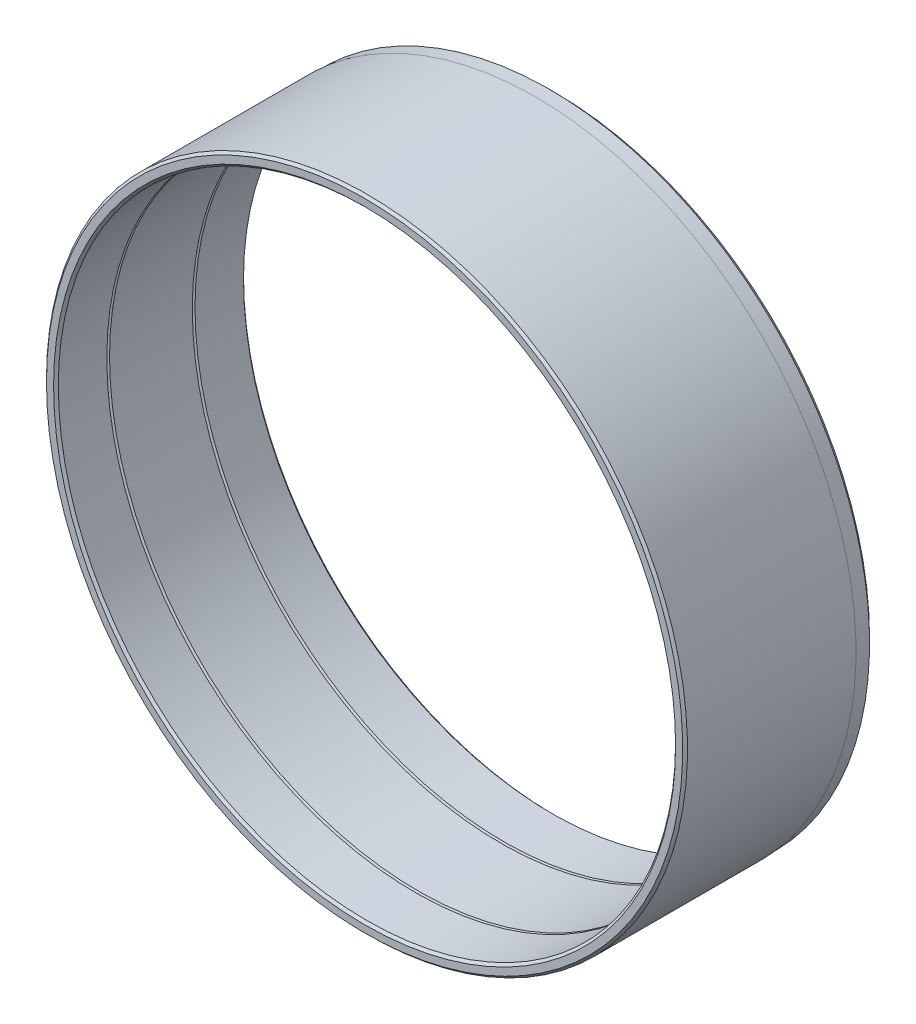
ISO-10303-21;
HEADER;
FILE_DESCRIPTION(('STEP AP214'),'2;1');
FILE_NAME('part.step','',(''),(''),'','','');
FILE_SCHEMA(('AUTOMOTIVE_DESIGN { 1 0 10303 214 1 1 1 1 }'));
ENDSEC;
DATA;
#1=APPLICATION_CONTEXT('core data for automotive mechanical design processes');
#2=APPLICATION_PROTOCOL_DEFINITION('international standard','automotive_design',2000,#1);
#3=PRODUCT_CONTEXT('',#1,'mechanical');
#4=PRODUCT('Part','Part','',(#3));
#5=PRODUCT_RELATED_PRODUCT_CATEGORY('part','',(#4));
#6=PRODUCT_DEFINITION_FORMATION('','',#4);
#7=PRODUCT_DEFINITION_CONTEXT('part definition',#1,'design');
#8=PRODUCT_DEFINITION('design','',#6,#7);
#9=PRODUCT_DEFINITION_SHAPE('','',#8);
#10=(LENGTH_UNIT() NAMED_UNIT(*) SI_UNIT(.MILLI.,.METRE.));
#11=(NAMED_UNIT(*) PLANE_ANGLE_UNIT() SI_UNIT($,.RADIAN.));
#12=(NAMED_UNIT(*) SI_UNIT($,.STERADIAN.) SOLID_ANGLE_UNIT());
#13=UNCERTAINTY_MEASURE_WITH_UNIT(LENGTH_MEASURE(1.E-05),#10,'distance_accuracy_value','');
#14=(GEOMETRIC_REPRESENTATION_CONTEXT(3) GLOBAL_UNCERTAINTY_ASSIGNED_CONTEXT((#13)) GLOBAL_UNIT_ASSIGNED_CONTEXT((#10,
#11,#12)) REPRESENTATION_CONTEXT('',''));
#15=CARTESIAN_POINT('',(0.,0.,0.));
#16=DIRECTION('',(0.,0.,1.));
#17=DIRECTION('',(1.,0.,0.));
#18=AXIS2_PLACEMENT_3D('',#15,#16,#17);
#19=CARTESIAN_POINT('',(0.,0.,0.));
#20=DIRECTION('',(0.,0.,-1.));
#21=DIRECTION('',(-1.,0.,0.));
#22=AXIS2_PLACEMENT_3D('',#19,#20,#21);
#23=PLANE('',#22);
#24=CARTESIAN_POINT('',(0.,0.,0.));
#25=DIRECTION('',(0.,0.,-1.));
#26=DIRECTION('',(-1.,0.,0.));
#27=AXIS2_PLACEMENT_3D('',#24,#25,#26);
#28=CIRCLE('',#27,65.5);
#29=CARTESIAN_POINT('',(-65.5,0.,0.));
#30=VERTEX_POINT('',#29);
#31=EDGE_CURVE('E53',#30,#30,#28,.F.);
#32=ORIENTED_EDGE('',*,*,#31,.T.);
#33=EDGE_LOOP('',(#32));
#34=FACE_BOUND('',#33,.T.);
#35=CARTESIAN_POINT('',(0.,0.,0.));
#36=DIRECTION('',(0.,0.,-1.));
#37=DIRECTION('',(-1.,0.,0.));
#38=AXIS2_PLACEMENT_3D('',#35,#36,#37);
#39=CIRCLE('',#38,66.35);
#40=CARTESIAN_POINT('',(-66.35,0.,0.));
#41=VERTEX_POINT('',#40);
#42=EDGE_CURVE('E65',#41,#41,#39,.T.);
#43=ORIENTED_EDGE('',*,*,#42,.T.);
#44=EDGE_LOOP('',(#43));
#45=FACE_BOUND('',#44,.T.);
#46=ADVANCED_FACE('F39',(#34,#45),#23,.T.);
#47=CARTESIAN_POINT('',(0.,0.,0.));
#48=DIRECTION('',(0.,0.,1.));
#49=DIRECTION('',(1.,0.,0.));
#50=AXIS2_PLACEMENT_3D('',#47,#48,#49);
#51=CONICAL_SURFACE('',#50,66.35,0.785398163397452);
#52=CARTESIAN_POINT('',(0.,0.,1.00000000000001));
#53=DIRECTION('',(0.,0.,-1.));
#54=DIRECTION('',(-1.,0.,0.));
#55=AXIS2_PLACEMENT_3D('',#52,#53,#54);
#56=CIRCLE('',#55,67.35);
#57=CARTESIAN_POINT('',(-67.35,0.,1.00000000000001));
#58=VERTEX_POINT('',#57);
#59=EDGE_CURVE('E69',#58,#58,#56,.T.);
#60=ORIENTED_EDGE('',*,*,#59,.T.);
#61=EDGE_LOOP('',(#60));
#62=FACE_BOUND('',#61,.T.);
#63=ORIENTED_EDGE('',*,*,#42,.F.);
#64=EDGE_LOOP('',(#63));
#65=FACE_BOUND('',#64,.T.);
#66=ADVANCED_FACE('F131',(#62,#65),#51,.T.);
#67=CARTESIAN_POINT('',(0.,0.,0.));
#68=DIRECTION('',(0.,0.,-1.));
#69=DIRECTION('',(-1.,0.,0.));
#70=AXIS2_PLACEMENT_3D('',#67,#68,#69);
#71=CYLINDRICAL_SURFACE('',#70,67.35);
#72=CARTESIAN_POINT('',(0.,0.,3.99999999999999));
#73=DIRECTION('',(0.,0.,-1.));
#74=DIRECTION('',(-1.,0.,0.));
#75=AXIS2_PLACEMENT_3D('',#72,#73,#74);
#76=CIRCLE('',#75,67.35);
#77=CARTESIAN_POINT('',(-67.35,0.,3.99999999999999));
#78=VERTEX_POINT('',#77);
#79=EDGE_CURVE('E73',#78,#78,#76,.T.);
#80=ORIENTED_EDGE('',*,*,#79,.T.);
#81=EDGE_LOOP('',(#80));
#82=FACE_BOUND('',#81,.T.);
#83=ORIENTED_EDGE('',*,*,#59,.F.);
#84=EDGE_LOOP('',(#83));
#85=FACE_BOUND('',#84,.T.);
#86=ADVANCED_FACE('F137',(#82,#85),#71,.T.);
#87=CARTESIAN_POINT('',(0.,67.5,4.));
#88=DIRECTION('',(0.,0.,-1.));
#89=DIRECTION('',(-1.,0.,0.));
#90=AXIS2_PLACEMENT_3D('',#87,#88,#89);
#91=PLANE('',#90);
#92=CARTESIAN_POINT('',(0.,0.,4.));
#93=DIRECTION('',(0.,0.,-1.));
#94=DIRECTION('',(-1.,0.,0.));
#95=AXIS2_PLACEMENT_3D('',#92,#93,#94);
#96=CIRCLE('',#95,67.5);
#97=CARTESIAN_POINT('',(-67.5,0.,4.));
#98=VERTEX_POINT('',#97);
#99=EDGE_CURVE('E77',#98,#98,#96,.T.);
#100=ORIENTED_EDGE('',*,*,#99,.T.);
#101=EDGE_LOOP('',(#100));
#102=FACE_BOUND('',#101,.T.);
#103=ORIENTED_EDGE('',*,*,#79,.F.);
#104=EDGE_LOOP('',(#103));
#105=FACE_BOUND('',#104,.T.);
#106=ADVANCED_FACE('F144',(#102,#105),#91,.T.);
#107=CARTESIAN_POINT('',(0.,0.,0.));
#108=DIRECTION('',(0.,0.,-1.));
#109=DIRECTION('',(-1.,0.,0.));
#110=AXIS2_PLACEMENT_3D('',#107,#108,#109);
#111=CYLINDRICAL_SURFACE('',#110,67.5);
#112=CARTESIAN_POINT('',(0.,0.,39.5));
#113=DIRECTION('',(0.,0.,-1.));
#114=DIRECTION('',(-1.,0.,0.));
#115=AXIS2_PLACEMENT_3D('',#112,#113,#114);
#116=CIRCLE('',#115,67.5);
#117=CARTESIAN_POINT('',(-67.5,0.,39.5));
#118=VERTEX_POINT('',#117);
#119=EDGE_CURVE('E81',#118,#118,#116,.T.);
#120=ORIENTED_EDGE('',*,*,#119,.T.);
#121=EDGE_LOOP('',(#120));
#122=FACE_BOUND('',#121,.T.);
#123=ORIENTED_EDGE('',*,*,#99,.F.);
#124=EDGE_LOOP('',(#123));
#125=FACE_BOUND('',#124,.T.);
#126=ADVANCED_FACE('F148',(#122,#125),#111,.T.);
#127=CARTESIAN_POINT('',(0.,0.,39.5));
#128=DIRECTION('',(0.,0.,-1.));
#129=DIRECTION('',(-1.,0.,0.));
#130=AXIS2_PLACEMENT_3D('',#127,#128,#129);
#131=CONICAL_SURFACE('',#130,67.5,0.785398163397448);
#132=CARTESIAN_POINT('',(0.,0.,40.));
#133=DIRECTION('',(0.,0.,-1.));
#134=DIRECTION('',(-1.,0.,0.));
#135=AXIS2_PLACEMENT_3D('',#132,#133,#134);
#136=CIRCLE('',#135,67.);
#137=CARTESIAN_POINT('',(-67.,0.,40.));
#138=VERTEX_POINT('',#137);
#139=EDGE_CURVE('E85',#138,#138,#136,.T.);
#140=ORIENTED_EDGE('',*,*,#139,.T.);
#141=EDGE_LOOP('',(#140));
#142=FACE_BOUND('',#141,.T.);
#143=ORIENTED_EDGE('',*,*,#119,.F.);
#144=EDGE_LOOP('',(#143));
#145=FACE_BOUND('',#144,.T.);
#146=ADVANCED_FACE('F152',(#142,#145),#131,.T.);
#147=CARTESIAN_POINT('',(0.,67.,40.));
#148=DIRECTION('',(0.,0.,1.));
#149=DIRECTION('',(1.,0.,0.));
#150=AXIS2_PLACEMENT_3D('',#147,#148,#149);
#151=PLANE('',#150);
#152=CARTESIAN_POINT('',(0.,0.,40.));
#153=DIRECTION('',(0.,0.,1.));
#154=DIRECTION('',(1.,0.,0.));
#155=AXIS2_PLACEMENT_3D('',#152,#153,#154);
#156=CIRCLE('',#155,65.5);
#157=CARTESIAN_POINT('',(65.5,0.,40.));
#158=VERTEX_POINT('',#157);
#159=EDGE_CURVE('E47',#158,#158,#156,.F.);
#160=ORIENTED_EDGE('',*,*,#159,.T.);
#161=EDGE_LOOP('',(#160));
#162=FACE_BOUND('',#161,.T.);
#163=ORIENTED_EDGE('',*,*,#139,.F.);
#164=EDGE_LOOP('',(#163));
#165=FACE_BOUND('',#164,.T.);
#166=ADVANCED_FACE('F156',(#162,#165),#151,.T.);
#167=CARTESIAN_POINT('',(0.,0.,0.));
#168=DIRECTION('',(0.,0.,-1.));
#169=DIRECTION('',(-1.,0.,0.));
#170=AXIS2_PLACEMENT_3D('',#167,#168,#169);
#171=CYLINDRICAL_SURFACE('',#170,65.);
#172=CARTESIAN_POINT('',(0.,0.,39.5));
#173=DIRECTION('',(0.,0.,1.));
#174=DIRECTION('',(1.,0.,0.));
#175=AXIS2_PLACEMENT_3D('',#172,#173,#174);
#176=CIRCLE('',#175,65.);
#177=CARTESIAN_POINT('',(65.,0.,39.5));
#178=VERTEX_POINT('',#177);
#179=EDGE_CURVE('E10',#178,#178,#176,.T.);
#180=ORIENTED_EDGE('',*,*,#179,.T.);
#181=EDGE_LOOP('',(#180));
#182=FACE_BOUND('',#181,.T.);
#183=CARTESIAN_POINT('',(0.,0.,29.2886751345948));
#184=DIRECTION('',(0.,0.,-1.));
#185=DIRECTION('',(-1.,0.,0.));
#186=AXIS2_PLACEMENT_3D('',#183,#184,#185);
#187=CIRCLE('',#186,65.);
#188=CARTESIAN_POINT('',(-65.,0.,29.2886751345948));
#189=VERTEX_POINT('',#188);
#190=EDGE_CURVE('E89',#189,#189,#187,.T.);
#191=ORIENTED_EDGE('',*,*,#190,.T.);
#192=EDGE_LOOP('',(#191));
#193=FACE_BOUND('',#192,.T.);
#194=ADVANCED_FACE('F160',(#182,#193),#171,.F.);
#195=CARTESIAN_POINT('',(0.,0.,29.));
#196=DIRECTION('',(0.,0.,-1.));
#197=DIRECTION('',(-1.,0.,0.));
#198=AXIS2_PLACEMENT_3D('',#195,#196,#197);
#199=CONICAL_SURFACE('',#198,65.5,1.04719755119659);
#200=ORIENTED_EDGE('',*,*,#190,.F.);
#201=EDGE_LOOP('',(#200));
#202=FACE_BOUND('',#201,.T.);
#203=CARTESIAN_POINT('',(0.,0.,29.));
#204=DIRECTION('',(0.,0.,-1.));
#205=DIRECTION('',(-1.,0.,0.));
#206=AXIS2_PLACEMENT_3D('',#203,#204,#205);
#207=CIRCLE('',#206,65.5);
#208=CARTESIAN_POINT('',(-65.5,0.,29.));
#209=VERTEX_POINT('',#208);
#210=EDGE_CURVE('E93',#209,#209,#207,.T.);
#211=ORIENTED_EDGE('',*,*,#210,.T.);
#212=EDGE_LOOP('',(#211));
#213=FACE_BOUND('',#212,.T.);
#214=ADVANCED_FACE('F163',(#202,#213),#199,.F.);
#215=CARTESIAN_POINT('',(0.,0.,28.7113248654052));
#216=DIRECTION('',(0.,0.,1.));
#217=DIRECTION('',(1.,0.,0.));
#218=AXIS2_PLACEMENT_3D('',#215,#216,#217);
#219=CONICAL_SURFACE('',#218,65.,1.04719755119659);
#220=ORIENTED_EDGE('',*,*,#210,.F.);
#221=EDGE_LOOP('',(#220));
#222=FACE_BOUND('',#221,.T.);
#223=CARTESIAN_POINT('',(0.,0.,28.7113248654052));
#224=DIRECTION('',(0.,0.,-1.));
#225=DIRECTION('',(-1.,0.,0.));
#226=AXIS2_PLACEMENT_3D('',#223,#224,#225);
#227=CIRCLE('',#226,65.);
#228=CARTESIAN_POINT('',(-65.,0.,28.7113248654052));
#229=VERTEX_POINT('',#228);
#230=EDGE_CURVE('E97',#229,#229,#227,.T.);
#231=ORIENTED_EDGE('',*,*,#230,.T.);
#232=EDGE_LOOP('',(#231));
#233=FACE_BOUND('',#232,.T.);
#234=ADVANCED_FACE('F166',(#222,#233),#219,.F.);
#235=CARTESIAN_POINT('',(0.,0.,0.));
#236=DIRECTION('',(0.,0.,-1.));
#237=DIRECTION('',(-1.,0.,0.));
#238=AXIS2_PLACEMENT_3D('',#235,#236,#237);
#239=CYLINDRICAL_SURFACE('',#238,65.);
#240=ORIENTED_EDGE('',*,*,#230,.F.);
#241=EDGE_LOOP('',(#240));
#242=FACE_BOUND('',#241,.T.);
#243=CARTESIAN_POINT('',(0.,0.,11.2886751345948));
#244=DIRECTION('',(0.,0.,-1.));
#245=DIRECTION('',(-1.,0.,0.));
#246=AXIS2_PLACEMENT_3D('',#243,#244,#245);
#247=CIRCLE('',#246,65.);
#248=CARTESIAN_POINT('',(-65.,0.,11.2886751345948));
#249=VERTEX_POINT('',#248);
#250=EDGE_CURVE('E101',#249,#249,#247,.T.);
#251=ORIENTED_EDGE('',*,*,#250,.T.);
#252=EDGE_LOOP('',(#251));
#253=FACE_BOUND('',#252,.T.);
#254=ADVANCED_FACE('F170',(#242,#253),#239,.F.);
#255=CARTESIAN_POINT('',(0.,0.,11.));
#256=DIRECTION('',(0.,0.,-1.));
#257=DIRECTION('',(-1.,0.,0.));
#258=AXIS2_PLACEMENT_3D('',#255,#256,#257);
#259=CONICAL_SURFACE('',#258,65.5,1.0471975511966);
#260=ORIENTED_EDGE('',*,*,#250,.F.);
#261=EDGE_LOOP('',(#260));
#262=FACE_BOUND('',#261,.T.);
#263=CARTESIAN_POINT('',(0.,0.,11.));
#264=DIRECTION('',(0.,0.,-1.));
#265=DIRECTION('',(-1.,0.,0.));
#266=AXIS2_PLACEMENT_3D('',#263,#264,#265);
#267=CIRCLE('',#266,65.5);
#268=CARTESIAN_POINT('',(-65.5,0.,11.));
#269=VERTEX_POINT('',#268);
#270=EDGE_CURVE('E105',#269,#269,#267,.T.);
#271=ORIENTED_EDGE('',*,*,#270,.T.);
#272=EDGE_LOOP('',(#271));
#273=FACE_BOUND('',#272,.T.);
#274=ADVANCED_FACE('F127',(#262,#273),#259,.F.);
#275=CARTESIAN_POINT('',(0.,0.,10.7113248654052));
#276=DIRECTION('',(0.,0.,1.));
#277=DIRECTION('',(1.,0.,0.));
#278=AXIS2_PLACEMENT_3D('',#275,#276,#277);
#279=CONICAL_SURFACE('',#278,65.,1.0471975511966);
#280=ORIENTED_EDGE('',*,*,#270,.F.);
#281=EDGE_LOOP('',(#280));
#282=FACE_BOUND('',#281,.T.);
#283=CARTESIAN_POINT('',(0.,0.,10.7113248654052));
#284=DIRECTION('',(0.,0.,-1.));
#285=DIRECTION('',(-1.,0.,0.));
#286=AXIS2_PLACEMENT_3D('',#283,#284,#285);
#287=CIRCLE('',#286,65.);
#288=CARTESIAN_POINT('',(-65.,0.,10.7113248654052));
#289=VERTEX_POINT('',#288);
#290=EDGE_CURVE('E109',#289,#289,#287,.T.);
#291=ORIENTED_EDGE('',*,*,#290,.T.);
#292=EDGE_LOOP('',(#291));
#293=FACE_BOUND('',#292,.T.);
#294=ADVANCED_FACE('F115',(#282,#293),#279,.F.);
#295=CARTESIAN_POINT('',(0.,0.,0.));
#296=DIRECTION('',(0.,0.,-1.));
#297=DIRECTION('',(-1.,0.,0.));
#298=AXIS2_PLACEMENT_3D('',#295,#296,#297);
#299=CYLINDRICAL_SURFACE('',#298,65.);
#300=CARTESIAN_POINT('',(0.,0.,0.5));
#301=DIRECTION('',(0.,0.,-1.));
#302=DIRECTION('',(-1.,0.,0.));
#303=AXIS2_PLACEMENT_3D('',#300,#301,#302);
#304=CIRCLE('',#303,65.);
#305=CARTESIAN_POINT('',(-65.,0.,0.5));
#306=VERTEX_POINT('',#305);
#307=EDGE_CURVE('E59',#306,#306,#304,.T.);
#308=ORIENTED_EDGE('',*,*,#307,.T.);
#309=EDGE_LOOP('',(#308));
#310=FACE_BOUND('',#309,.T.);
#311=ORIENTED_EDGE('',*,*,#290,.F.);
#312=EDGE_LOOP('',(#311));
#313=FACE_BOUND('',#312,.T.);
#314=ADVANCED_FACE('F117',(#310,#313),#299,.F.);
#315=CARTESIAN_POINT('',(0.,0.,0.5));
#316=DIRECTION('',(0.,0.,-1.));
#317=DIRECTION('',(-1.,0.,0.));
#318=AXIS2_PLACEMENT_3D('',#315,#316,#317);
#319=CONICAL_SURFACE('',#318,65.,0.785398163397476);
#320=ORIENTED_EDGE('',*,*,#31,.F.);
#321=EDGE_LOOP('',(#320));
#322=FACE_BOUND('',#321,.T.);
#323=ORIENTED_EDGE('',*,*,#307,.F.);
#324=EDGE_LOOP('',(#323));
#325=FACE_BOUND('',#324,.T.);
#326=ADVANCED_FACE('F119',(#322,#325),#319,.F.);
#327=CARTESIAN_POINT('',(0.,0.,40.));
#328=DIRECTION('',(0.,0.,1.));
#329=DIRECTION('',(1.,0.,0.));
#330=AXIS2_PLACEMENT_3D('',#327,#328,#329);
#331=CONICAL_SURFACE('',#330,65.5,0.785398163397448);
#332=ORIENTED_EDGE('',*,*,#179,.F.);
#333=EDGE_LOOP('',(#332));
#334=FACE_BOUND('',#333,.T.);
#335=ORIENTED_EDGE('',*,*,#159,.F.);
#336=EDGE_LOOP('',(#335));
#337=FACE_BOUND('',#336,.T.);
#338=ADVANCED_FACE('F41',(#334,#337),#331,.F.);
#339=CLOSED_SHELL('',(#46,#66,#86,#106,#126,#146,#166,#194,#214,#234,#254,#274,#294,#314,#326,#338));
#340=MANIFOLD_SOLID_BREP('B2',#339);
#341=ADVANCED_BREP_SHAPE_REPRESENTATION('',(#18,#340),#14);
#342=SHAPE_DEFINITION_REPRESENTATION(#9,#341);
ENDSEC;
END-ISO-10303-21;
